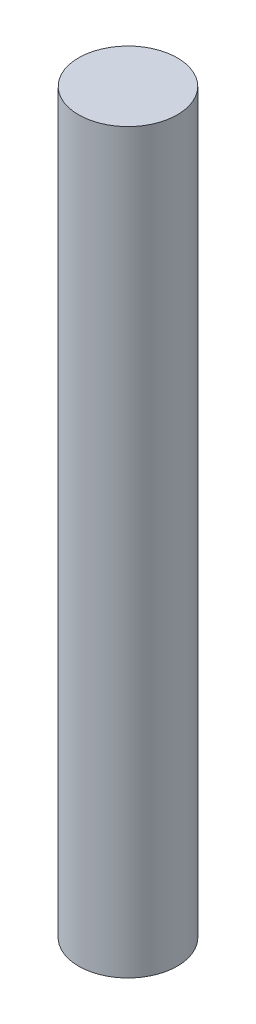
ISO-10303-21;
HEADER;
FILE_DESCRIPTION(('STEP AP214'),'2;1');
FILE_NAME('part.step','',(''),(''),'','','');
FILE_SCHEMA(('AUTOMOTIVE_DESIGN { 1 0 10303 214 1 1 1 1 }'));
ENDSEC;
DATA;
#1=APPLICATION_CONTEXT('core data for automotive mechanical design processes');
#2=APPLICATION_PROTOCOL_DEFINITION('international standard','automotive_design',2000,#1);
#3=PRODUCT_CONTEXT('',#1,'mechanical');
#4=PRODUCT('Part','Part','',(#3));
#5=PRODUCT_RELATED_PRODUCT_CATEGORY('part','',(#4));
#6=PRODUCT_DEFINITION_FORMATION('','',#4);
#7=PRODUCT_DEFINITION_CONTEXT('part definition',#1,'design');
#8=PRODUCT_DEFINITION('design','',#6,#7);
#9=PRODUCT_DEFINITION_SHAPE('','',#8);
#10=(LENGTH_UNIT() NAMED_UNIT(*) SI_UNIT(.MILLI.,.METRE.));
#11=(NAMED_UNIT(*) PLANE_ANGLE_UNIT() SI_UNIT($,.RADIAN.));
#12=(NAMED_UNIT(*) SI_UNIT($,.STERADIAN.) SOLID_ANGLE_UNIT());
#13=UNCERTAINTY_MEASURE_WITH_UNIT(LENGTH_MEASURE(1.E-05),#10,'distance_accuracy_value','');
#14=(GEOMETRIC_REPRESENTATION_CONTEXT(3) GLOBAL_UNCERTAINTY_ASSIGNED_CONTEXT((#13)) GLOBAL_UNIT_ASSIGNED_CONTEXT((#10,
#11,#12)) REPRESENTATION_CONTEXT('',''));
#15=CARTESIAN_POINT('',(0.,0.,0.));
#16=DIRECTION('',(0.,0.,1.));
#17=DIRECTION('',(1.,0.,0.));
#18=AXIS2_PLACEMENT_3D('',#15,#16,#17);
#19=CARTESIAN_POINT('',(0.,8.88721891696069,0.));
#20=DIRECTION('',(0.,-1.,0.));
#21=DIRECTION('',(0.,0.,-1.));
#22=AXIS2_PLACEMENT_3D('',#19,#20,#21);
#23=CYLINDRICAL_SURFACE('',#22,0.595);
#24=CARTESIAN_POINT('',(0.,8.88721891696069,0.));
#25=DIRECTION('',(0.,1.,0.));
#26=DIRECTION('',(0.,0.,1.));
#27=AXIS2_PLACEMENT_3D('',#24,#25,#26);
#28=CIRCLE('',#27,0.595);
#29=CARTESIAN_POINT('',(0.,8.88721891696069,0.595));
#30=VERTEX_POINT('',#29);
#31=EDGE_CURVE('E10',#30,#30,#28,.T.);
#32=ORIENTED_EDGE('',*,*,#31,.F.);
#33=EDGE_LOOP('',(#32));
#34=FACE_BOUND('',#33,.T.);
#35=CARTESIAN_POINT('',(0.,0.,0.));
#36=DIRECTION('',(0.,1.,0.));
#37=DIRECTION('',(0.,0.,1.));
#38=AXIS2_PLACEMENT_3D('',#35,#36,#37);
#39=CIRCLE('',#38,0.595);
#40=CARTESIAN_POINT('',(0.,0.,0.595));
#41=VERTEX_POINT('',#40);
#42=EDGE_CURVE('E34',#41,#41,#39,.T.);
#43=ORIENTED_EDGE('',*,*,#42,.T.);
#44=EDGE_LOOP('',(#43));
#45=FACE_BOUND('',#44,.T.);
#46=ADVANCED_FACE('F31',(#34,#45),#23,.T.);
#47=CARTESIAN_POINT('',(0.,8.88721891696069,0.));
#48=DIRECTION('',(0.,1.,0.));
#49=DIRECTION('',(0.,0.,1.));
#50=AXIS2_PLACEMENT_3D('',#47,#48,#49);
#51=PLANE('',#50);
#52=ORIENTED_EDGE('',*,*,#31,.T.);
#53=EDGE_LOOP('',(#52));
#54=FACE_BOUND('',#53,.T.);
#55=ADVANCED_FACE('F46',(#54),#51,.T.);
#56=CARTESIAN_POINT('',(0.,0.,0.));
#57=DIRECTION('',(0.,1.,0.));
#58=DIRECTION('',(0.,0.,1.));
#59=AXIS2_PLACEMENT_3D('',#56,#57,#58);
#60=PLANE('',#59);
#61=ORIENTED_EDGE('',*,*,#42,.F.);
#62=EDGE_LOOP('',(#61));
#63=FACE_BOUND('',#62,.T.);
#64=ADVANCED_FACE('F44',(#63),#60,.F.);
#65=CLOSED_SHELL('',(#46,#55,#64));
#66=MANIFOLD_SOLID_BREP('B2',#65);
#67=ADVANCED_BREP_SHAPE_REPRESENTATION('',(#18,#66),#14);
#68=SHAPE_DEFINITION_REPRESENTATION(#9,#67);
ENDSEC;
END-ISO-10303-21;
